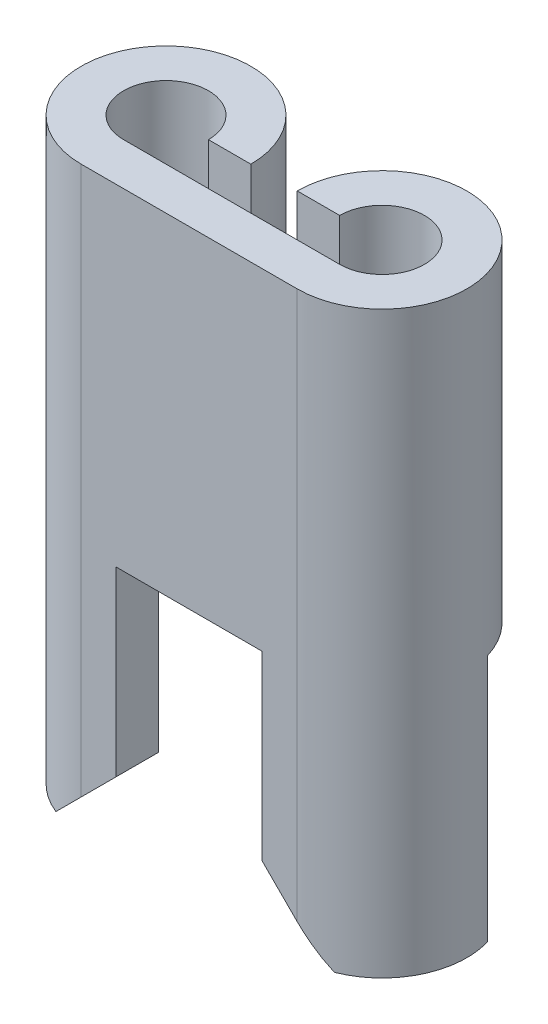
ISO-10303-21;
HEADER;
FILE_DESCRIPTION(('STEP AP214'),'2;1');
FILE_NAME('part.step','',(''),(''),'','','');
FILE_SCHEMA(('AUTOMOTIVE_DESIGN { 1 0 10303 214 1 1 1 1 }'));
ENDSEC;
DATA;
#1=APPLICATION_CONTEXT('core data for automotive mechanical design processes');
#2=APPLICATION_PROTOCOL_DEFINITION('international standard','automotive_design',2000,#1);
#3=PRODUCT_CONTEXT('',#1,'mechanical');
#4=PRODUCT('Part','Part','',(#3));
#5=PRODUCT_RELATED_PRODUCT_CATEGORY('part','',(#4));
#6=PRODUCT_DEFINITION_FORMATION('','',#4);
#7=PRODUCT_DEFINITION_CONTEXT('part definition',#1,'design');
#8=PRODUCT_DEFINITION('design','',#6,#7);
#9=PRODUCT_DEFINITION_SHAPE('','',#8);
#10=(LENGTH_UNIT() NAMED_UNIT(*) SI_UNIT(.MILLI.,.METRE.));
#11=(NAMED_UNIT(*) PLANE_ANGLE_UNIT() SI_UNIT($,.RADIAN.));
#12=(NAMED_UNIT(*) SI_UNIT($,.STERADIAN.) SOLID_ANGLE_UNIT());
#13=UNCERTAINTY_MEASURE_WITH_UNIT(LENGTH_MEASURE(1.E-05),#10,'distance_accuracy_value','');
#14=(GEOMETRIC_REPRESENTATION_CONTEXT(3) GLOBAL_UNCERTAINTY_ASSIGNED_CONTEXT((#13)) GLOBAL_UNIT_ASSIGNED_CONTEXT((#10,
#11,#12)) REPRESENTATION_CONTEXT('',''));
#15=CARTESIAN_POINT('',(0.,0.,0.));
#16=DIRECTION('',(0.,0.,1.));
#17=DIRECTION('',(1.,0.,0.));
#18=AXIS2_PLACEMENT_3D('',#15,#16,#17);
#19=CARTESIAN_POINT('',(7.3914,0.,0.));
#20=DIRECTION('',(0.,-1.,0.));
#21=DIRECTION('',(0.,0.,-1.));
#22=AXIS2_PLACEMENT_3D('',#19,#20,#21);
#23=PLANE('',#22);
#24=DIRECTION('',(1.,0.,0.));
#25=VECTOR('',#24,1.);
#26=CARTESIAN_POINT('',(2.8956,0.,-1.27));
#27=LINE('',#26,#25);
#28=CARTESIAN_POINT('',(6.4378208330104,0.,-1.27));
#29=VERTEX_POINT('',#28);
#30=CARTESIAN_POINT('',(7.32578189733086,0.,-1.27));
#31=VERTEX_POINT('',#30);
#32=EDGE_CURVE('E126',#29,#31,#27,.T.);
#33=ORIENTED_EDGE('',*,*,#32,.T.);
#34=CARTESIAN_POINT('',(5.7658,0.,-0.8128));
#35=DIRECTION('',(0.,1.,0.));
#36=DIRECTION('',(-1.,0.,0.));
#37=AXIS2_PLACEMENT_3D('',#34,#35,#36);
#38=CIRCLE('',#37,1.6256);
#39=CARTESIAN_POINT('',(6.36377916698959,0.,0.698820413942082));
#40=VERTEX_POINT('',#39);
#41=EDGE_CURVE('E192',#40,#31,#38,.T.);
#42=ORIENTED_EDGE('',*,*,#41,.F.);
#43=DIRECTION('',(0.,0.,1.));
#44=VECTOR('',#43,1.);
#45=CARTESIAN_POINT('',(6.36377916698959,0.,-0.635));
#46=LINE('',#45,#44);
#47=CARTESIAN_POINT('',(6.36377916698959,0.,-0.262286825001952));
#48=VERTEX_POINT('',#47);
#49=EDGE_CURVE('E128',#48,#40,#46,.T.);
#50=ORIENTED_EDGE('',*,*,#49,.F.);
#51=CARTESIAN_POINT('',(5.7658,0.,-0.8128));
#52=DIRECTION('',(0.,1.,0.));
#53=DIRECTION('',(-1.,0.,0.));
#54=AXIS2_PLACEMENT_3D('',#51,#52,#53);
#55=CIRCLE('',#54,0.8128);
#56=EDGE_CURVE('E20',#48,#29,#55,.T.);
#57=ORIENTED_EDGE('',*,*,#56,.T.);
#58=EDGE_LOOP('',(#33,#42,#50,#57));
#59=FACE_BOUND('',#58,.T.);
#60=ADVANCED_FACE('F17',(#59),#23,.T.);
#61=CARTESIAN_POINT('',(7.9756,4.7498,-1.27));
#62=DIRECTION('',(0.,1.,0.));
#63=DIRECTION('',(0.,0.,1.));
#64=AXIS2_PLACEMENT_3D('',#61,#62,#63);
#65=PLANE('',#64);
#66=DIRECTION('',(1.,0.,0.));
#67=VECTOR('',#66,1.);
#68=CARTESIAN_POINT('',(4.95299999999999,4.7498,-0.8128));
#69=LINE('',#68,#67);
#70=CARTESIAN_POINT('',(4.14019999999999,4.7498,-0.8128));
#71=VERTEX_POINT('',#70);
#72=CARTESIAN_POINT('',(4.953,4.7498,-0.8128));
#73=VERTEX_POINT('',#72);
#74=EDGE_CURVE('E130',#71,#73,#69,.T.);
#75=ORIENTED_EDGE('',*,*,#74,.F.);
#76=CARTESIAN_POINT('',(5.76579999999999,4.7498,-0.8128));
#77=DIRECTION('',(0.,1.,0.));
#78=DIRECTION('',(-1.,0.,0.));
#79=AXIS2_PLACEMENT_3D('',#76,#77,#78);
#80=CIRCLE('',#79,1.6256);
#81=CARTESIAN_POINT('',(7.32578189733086,4.7498,-1.27));
#82=VERTEX_POINT('',#81);
#83=EDGE_CURVE('E189',#82,#71,#80,.T.);
#84=ORIENTED_EDGE('',*,*,#83,.F.);
#85=DIRECTION('',(1.,0.,0.));
#86=VECTOR('',#85,1.);
#87=CARTESIAN_POINT('',(2.8956,4.7498,-1.27));
#88=LINE('',#87,#86);
#89=CARTESIAN_POINT('',(6.4378208330104,4.7498,-1.27));
#90=VERTEX_POINT('',#89);
#91=EDGE_CURVE('E139',#82,#90,#88,.F.);
#92=ORIENTED_EDGE('',*,*,#91,.T.);
#93=CARTESIAN_POINT('',(5.76579999999999,4.7498,-0.8128));
#94=DIRECTION('',(0.,1.,0.));
#95=DIRECTION('',(-1.,0.,0.));
#96=AXIS2_PLACEMENT_3D('',#93,#94,#95);
#97=CIRCLE('',#96,0.8128);
#98=EDGE_CURVE('E144',#90,#73,#97,.T.);
#99=ORIENTED_EDGE('',*,*,#98,.T.);
#100=EDGE_LOOP('',(#75,#84,#92,#99));
#101=FACE_BOUND('',#100,.T.);
#102=ADVANCED_FACE('F484',(#101),#65,.F.);
#103=CARTESIAN_POINT('',(4.95299999999999,0.,-0.8128));
#104=DIRECTION('',(0.,0.,1.));
#105=DIRECTION('',(1.,0.,0.));
#106=AXIS2_PLACEMENT_3D('',#103,#104,#105);
#107=PLANE('',#106);
#108=DIRECTION('',(1.,0.,0.));
#109=VECTOR('',#108,1.);
#110=CARTESIAN_POINT('',(4.95299999999999,11.0998,-0.8128));
#111=LINE('',#110,#109);
#112=CARTESIAN_POINT('',(4.95299999999999,11.0998,-0.8128));
#113=VERTEX_POINT('',#112);
#114=CARTESIAN_POINT('',(4.14019999999999,11.0998,-0.8128));
#115=VERTEX_POINT('',#114);
#116=EDGE_CURVE('E140',#113,#115,#111,.F.);
#117=ORIENTED_EDGE('',*,*,#116,.T.);
#118=DIRECTION('',(0.,1.,0.));
#119=VECTOR('',#118,1.);
#120=CARTESIAN_POINT('',(4.14019999999999,0.,-0.8128));
#121=LINE('',#120,#119);
#122=EDGE_CURVE('E152',#71,#115,#121,.T.);
#123=ORIENTED_EDGE('',*,*,#122,.F.);
#124=ORIENTED_EDGE('',*,*,#74,.T.);
#125=DIRECTION('',(0.,1.,0.));
#126=VECTOR('',#125,1.);
#127=CARTESIAN_POINT('',(4.953,0.,-0.8128));
#128=LINE('',#127,#126);
#129=EDGE_CURVE('E155',#73,#113,#128,.T.);
#130=ORIENTED_EDGE('',*,*,#129,.T.);
#131=EDGE_LOOP('',(#117,#123,#124,#130));
#132=FACE_BOUND('',#131,.T.);
#133=ADVANCED_FACE('F239',(#132),#107,.T.);
#134=CARTESIAN_POINT('',(2.8956,2.3749,-1.27));
#135=DIRECTION('',(0.,0.,1.));
#136=DIRECTION('',(1.,0.,0.));
#137=AXIS2_PLACEMENT_3D('',#134,#135,#136);
#138=PLANE('',#137);
#139=ORIENTED_EDGE('',*,*,#91,.F.);
#140=DIRECTION('',(0.,1.,0.));
#141=VECTOR('',#140,1.);
#142=CARTESIAN_POINT('',(7.32578189733086,0.,-1.27));
#143=LINE('',#142,#141);
#144=EDGE_CURVE('E137',#31,#82,#143,.T.);
#145=ORIENTED_EDGE('',*,*,#144,.F.);
#146=ORIENTED_EDGE('',*,*,#32,.F.);
#147=DIRECTION('',(0.,1.,0.));
#148=VECTOR('',#147,1.);
#149=CARTESIAN_POINT('',(6.4378208330104,0.,-1.27));
#150=LINE('',#149,#148);
#151=EDGE_CURVE('E135',#29,#90,#150,.T.);
#152=ORIENTED_EDGE('',*,*,#151,.T.);
#153=EDGE_LOOP('',(#139,#145,#146,#152));
#154=FACE_BOUND('',#153,.T.);
#155=ADVANCED_FACE('F134',(#154),#138,.F.);
#156=CARTESIAN_POINT('',(2.4384,11.0998,-0.8128));
#157=DIRECTION('',(0.,0.,1.));
#158=DIRECTION('',(1.,0.,0.));
#159=AXIS2_PLACEMENT_3D('',#156,#157,#158);
#160=PLANE('',#159);
#161=DIRECTION('',(1.,0.,0.));
#162=VECTOR('',#161,1.);
#163=CARTESIAN_POINT('',(2.4384,11.0998,-0.8128));
#164=LINE('',#163,#162);
#165=CARTESIAN_POINT('',(3.2512,11.0998,-0.8128));
#166=VERTEX_POINT('',#165);
#167=CARTESIAN_POINT('',(2.4384,11.0998,-0.8128));
#168=VERTEX_POINT('',#167);
#169=EDGE_CURVE('E207',#166,#168,#164,.F.);
#170=ORIENTED_EDGE('',*,*,#169,.T.);
#171=DIRECTION('',(0.,1.,0.));
#172=VECTOR('',#171,1.);
#173=CARTESIAN_POINT('',(2.4384,11.0998,-0.8128));
#174=LINE('',#173,#172);
#175=CARTESIAN_POINT('',(2.4384,4.7498,-0.8128));
#176=VERTEX_POINT('',#175);
#177=EDGE_CURVE('E204',#168,#176,#174,.F.);
#178=ORIENTED_EDGE('',*,*,#177,.T.);
#179=DIRECTION('',(1.,0.,0.));
#180=VECTOR('',#179,1.);
#181=CARTESIAN_POINT('',(2.4384,4.7498,-0.8128));
#182=LINE('',#181,#180);
#183=CARTESIAN_POINT('',(3.2512,4.7498,-0.8128));
#184=VERTEX_POINT('',#183);
#185=EDGE_CURVE('E200',#176,#184,#182,.T.);
#186=ORIENTED_EDGE('',*,*,#185,.T.);
#187=DIRECTION('',(0.,-1.,0.));
#188=VECTOR('',#187,1.);
#189=CARTESIAN_POINT('',(3.2512,11.0998,-0.8128));
#190=LINE('',#189,#188);
#191=EDGE_CURVE('E187',#166,#184,#190,.T.);
#192=ORIENTED_EDGE('',*,*,#191,.F.);
#193=EDGE_LOOP('',(#170,#178,#186,#192));
#194=FACE_BOUND('',#193,.T.);
#195=ADVANCED_FACE('F346',(#194),#160,.T.);
#196=CARTESIAN_POINT('',(2.29762083301041,0.,-1.27));
#197=DIRECTION('',(-1.,0.,0.));
#198=DIRECTION('',(0.,0.,1.));
#199=AXIS2_PLACEMENT_3D('',#196,#197,#198);
#200=PLANE('',#199);
#201=DIRECTION('',(0.,1.,0.));
#202=VECTOR('',#201,1.);
#203=CARTESIAN_POINT('',(2.29762083301041,5.5499,0.));
#204=LINE('',#203,#202);
#205=CARTESIAN_POINT('',(2.29762083301041,1.27,0.));
#206=VERTEX_POINT('',#205);
#207=CARTESIAN_POINT('',(2.29762083301041,4.7498,0.));
#208=VERTEX_POINT('',#207);
#209=EDGE_CURVE('E146',#206,#208,#204,.T.);
#210=ORIENTED_EDGE('',*,*,#209,.T.);
#211=DIRECTION('',(0.,0.,1.));
#212=VECTOR('',#211,1.);
#213=CARTESIAN_POINT('',(2.29762083301041,4.7498,-1.27));
#214=LINE('',#213,#212);
#215=CARTESIAN_POINT('',(2.29762083301041,4.7498,0.8128));
#216=VERTEX_POINT('',#215);
#217=EDGE_CURVE('E206',#208,#216,#214,.T.);
#218=ORIENTED_EDGE('',*,*,#217,.T.);
#219=DIRECTION('',(0.,1.,0.));
#220=VECTOR('',#219,1.);
#221=CARTESIAN_POINT('',(2.29762083301041,5.5499,0.8128));
#222=LINE('',#221,#220);
#223=CARTESIAN_POINT('',(2.29762083301041,1.27,0.8128));
#224=VERTEX_POINT('',#223);
#225=EDGE_CURVE('E278',#224,#216,#222,.T.);
#226=ORIENTED_EDGE('',*,*,#225,.F.);
#227=DIRECTION('',(0.,0.,1.));
#228=VECTOR('',#227,1.);
#229=CARTESIAN_POINT('',(2.29762083301041,1.27,-0.635));
#230=LINE('',#229,#228);
#231=EDGE_CURVE('E288',#206,#224,#230,.T.);
#232=ORIENTED_EDGE('',*,*,#231,.F.);
#233=EDGE_LOOP('',(#210,#218,#226,#232));
#234=FACE_BOUND('',#233,.T.);
#235=ADVANCED_FACE('F348',(#234),#200,.F.);
#236=CARTESIAN_POINT('',(2.29762083301041,4.7498,-1.27));
#237=DIRECTION('',(0.,1.,0.));
#238=DIRECTION('',(0.,0.,1.));
#239=AXIS2_PLACEMENT_3D('',#236,#237,#238);
#240=PLANE('',#239);
#241=DIRECTION('',(0.,0.,-1.));
#242=VECTOR('',#241,1.);
#243=CARTESIAN_POINT('',(5.09377916698959,4.7498,-1.27));
#244=LINE('',#243,#242);
#245=CARTESIAN_POINT('',(5.09377916698959,4.7498,0.));
#246=VERTEX_POINT('',#245);
#247=CARTESIAN_POINT('',(5.09377916698959,4.7498,0.8128));
#248=VERTEX_POINT('',#247);
#249=EDGE_CURVE('E213',#246,#248,#244,.F.);
#250=ORIENTED_EDGE('',*,*,#249,.T.);
#251=DIRECTION('',(1.,0.,0.));
#252=VECTOR('',#251,1.);
#253=CARTESIAN_POINT('',(3.6957,4.7498,0.8128));
#254=LINE('',#253,#252);
#255=EDGE_CURVE('E269',#216,#248,#254,.T.);
#256=ORIENTED_EDGE('',*,*,#255,.F.);
#257=ORIENTED_EDGE('',*,*,#217,.F.);
#258=DIRECTION('',(1.,0.,0.));
#259=VECTOR('',#258,1.);
#260=CARTESIAN_POINT('',(3.6957,4.7498,0.));
#261=LINE('',#260,#259);
#262=EDGE_CURVE('E150',#208,#246,#261,.T.);
#263=ORIENTED_EDGE('',*,*,#262,.T.);
#264=EDGE_LOOP('',(#250,#256,#257,#263));
#265=FACE_BOUND('',#264,.T.);
#266=ADVANCED_FACE('F355',(#265),#240,.F.);
#267=CARTESIAN_POINT('',(5.09377916698959,4.7498,-1.27));
#268=DIRECTION('',(1.,0.,0.));
#269=DIRECTION('',(0.,0.,-1.));
#270=AXIS2_PLACEMENT_3D('',#267,#268,#269);
#271=PLANE('',#270);
#272=DIRECTION('',(0.,1.,0.));
#273=VECTOR('',#272,1.);
#274=CARTESIAN_POINT('',(5.09377916698959,5.5499,0.8128));
#275=LINE('',#274,#273);
#276=CARTESIAN_POINT('',(5.09377916698959,1.27,0.8128));
#277=VERTEX_POINT('',#276);
#278=EDGE_CURVE('E259',#248,#277,#275,.F.);
#279=ORIENTED_EDGE('',*,*,#278,.F.);
#280=ORIENTED_EDGE('',*,*,#249,.F.);
#281=DIRECTION('',(0.,1.,0.));
#282=VECTOR('',#281,1.);
#283=CARTESIAN_POINT('',(5.09377916698959,5.5499,0.));
#284=LINE('',#283,#282);
#285=CARTESIAN_POINT('',(5.09377916698959,1.27,0.));
#286=VERTEX_POINT('',#285);
#287=EDGE_CURVE('E226',#246,#286,#284,.F.);
#288=ORIENTED_EDGE('',*,*,#287,.T.);
#289=DIRECTION('',(0.,0.,1.));
#290=VECTOR('',#289,1.);
#291=CARTESIAN_POINT('',(5.09377916698959,1.27,-0.635));
#292=LINE('',#291,#290);
#293=EDGE_CURVE('E196',#277,#286,#292,.F.);
#294=ORIENTED_EDGE('',*,*,#293,.F.);
#295=EDGE_LOOP('',(#279,#280,#288,#294));
#296=FACE_BOUND('',#295,.T.);
#297=ADVANCED_FACE('F387',(#296),#271,.F.);
#298=CARTESIAN_POINT('',(5.72877916698959,0.635,-0.635));
#299=DIRECTION('',(-0.707106781186548,-0.707106781186547,0.));
#300=DIRECTION('',(0.707106781186547,-0.707106781186548,0.));
#301=AXIS2_PLACEMENT_3D('',#298,#299,#300);
#302=PLANE('',#301);
#303=ORIENTED_EDGE('',*,*,#293,.T.);
#304=DIRECTION('',(0.707106781186547,-0.707106781186548,0.));
#305=VECTOR('',#304,1.);
#306=CARTESIAN_POINT('',(5.09377916698959,1.27,0.));
#307=LINE('',#306,#305);
#308=CARTESIAN_POINT('',(5.7658,0.597979166989594,0.));
#309=VERTEX_POINT('',#308);
#310=EDGE_CURVE('E223',#286,#309,#307,.T.);
#311=ORIENTED_EDGE('',*,*,#310,.T.);
#312=CARTESIAN_POINT('',(5.7658,0.597979166989595,-0.8128));
#313=DIRECTION('',(-0.707106781186548,-0.707106781186547,0.));
#314=DIRECTION('',(-0.707106781186547,0.707106781186548,0.));
#315=AXIS2_PLACEMENT_3D('',#312,#313,#314);
#316=ELLIPSE('',#315,1.14947278349685,0.8128);
#317=EDGE_CURVE('E147',#309,#48,#316,.F.);
#318=ORIENTED_EDGE('',*,*,#317,.T.);
#319=ORIENTED_EDGE('',*,*,#49,.T.);
#320=CARTESIAN_POINT('',(5.7658,0.597979166989595,-0.8128));
#321=DIRECTION('',(-0.707106781186548,-0.707106781186547,0.));
#322=DIRECTION('',(-0.707106781186547,0.707106781186548,0.));
#323=AXIS2_PLACEMENT_3D('',#320,#321,#322);
#324=ELLIPSE('',#323,2.29894556699371,1.6256);
#325=CARTESIAN_POINT('',(5.7658,0.597979166989593,0.8128));
#326=VERTEX_POINT('',#325);
#327=EDGE_CURVE('E194',#326,#40,#324,.F.);
#328=ORIENTED_EDGE('',*,*,#327,.F.);
#329=DIRECTION('',(0.707106781186547,-0.707106781186548,0.));
#330=VECTOR('',#329,1.);
#331=CARTESIAN_POINT('',(5.09377916698959,1.27,0.8128));
#332=LINE('',#331,#330);
#333=EDGE_CURVE('E256',#277,#326,#332,.T.);
#334=ORIENTED_EDGE('',*,*,#333,.F.);
#335=EDGE_LOOP('',(#303,#311,#318,#319,#328,#334));
#336=FACE_BOUND('',#335,.T.);
#337=ADVANCED_FACE('F384',(#336),#302,.T.);
#338=CARTESIAN_POINT('',(5.7658,0.,-0.8128));
#339=DIRECTION('',(0.,1.,0.));
#340=DIRECTION('',(-1.,0.,0.));
#341=AXIS2_PLACEMENT_3D('',#338,#339,#340);
#342=CYLINDRICAL_SURFACE('',#341,1.6256);
#343=ORIENTED_EDGE('',*,*,#122,.T.);
#344=CARTESIAN_POINT('',(5.76579999999999,11.0998,-0.8128));
#345=DIRECTION('',(0.,1.,0.));
#346=DIRECTION('',(-1.,0.,0.));
#347=AXIS2_PLACEMENT_3D('',#344,#345,#346);
#348=CIRCLE('',#347,1.6256);
#349=CARTESIAN_POINT('',(5.7658,11.0998,0.8128));
#350=VERTEX_POINT('',#349);
#351=EDGE_CURVE('E174',#350,#115,#348,.T.);
#352=ORIENTED_EDGE('',*,*,#351,.F.);
#353=DIRECTION('',(0.,1.,0.));
#354=VECTOR('',#353,1.);
#355=CARTESIAN_POINT('',(5.7658,5.5499,0.8128));
#356=LINE('',#355,#354);
#357=EDGE_CURVE('E254',#326,#350,#356,.T.);
#358=ORIENTED_EDGE('',*,*,#357,.F.);
#359=ORIENTED_EDGE('',*,*,#327,.T.);
#360=ORIENTED_EDGE('',*,*,#41,.T.);
#361=ORIENTED_EDGE('',*,*,#144,.T.);
#362=ORIENTED_EDGE('',*,*,#83,.T.);
#363=EDGE_LOOP('',(#343,#352,#358,#359,#360,#361,#362));
#364=FACE_BOUND('',#363,.T.);
#365=ADVANCED_FACE('F248',(#364),#342,.T.);
#366=CARTESIAN_POINT('',(5.7658,0.,-0.8128));
#367=DIRECTION('',(0.,1.,0.));
#368=DIRECTION('',(-1.,0.,0.));
#369=AXIS2_PLACEMENT_3D('',#366,#367,#368);
#370=CYLINDRICAL_SURFACE('',#369,0.8128);
#371=ORIENTED_EDGE('',*,*,#98,.F.);
#372=ORIENTED_EDGE('',*,*,#151,.F.);
#373=ORIENTED_EDGE('',*,*,#56,.F.);
#374=ORIENTED_EDGE('',*,*,#317,.F.);
#375=DIRECTION('',(0.,1.,0.));
#376=VECTOR('',#375,1.);
#377=CARTESIAN_POINT('',(5.7658,5.5499,0.));
#378=LINE('',#377,#376);
#379=CARTESIAN_POINT('',(5.7658,11.0998,0.));
#380=VERTEX_POINT('',#379);
#381=EDGE_CURVE('E225',#309,#380,#378,.T.);
#382=ORIENTED_EDGE('',*,*,#381,.T.);
#383=CARTESIAN_POINT('',(5.76579999999999,11.0998,-0.8128));
#384=DIRECTION('',(0.,1.,0.));
#385=DIRECTION('',(-1.,0.,0.));
#386=AXIS2_PLACEMENT_3D('',#383,#384,#385);
#387=CIRCLE('',#386,0.8128);
#388=EDGE_CURVE('E171',#113,#380,#387,.F.);
#389=ORIENTED_EDGE('',*,*,#388,.F.);
#390=ORIENTED_EDGE('',*,*,#129,.F.);
#391=EDGE_LOOP('',(#371,#372,#373,#374,#382,#389,#390));
#392=FACE_BOUND('',#391,.T.);
#393=ADVANCED_FACE('F142',(#392),#370,.F.);
#394=CARTESIAN_POINT('',(3.6957,5.5499,0.));
#395=DIRECTION('',(0.,0.,1.));
#396=DIRECTION('',(1.,0.,0.));
#397=AXIS2_PLACEMENT_3D('',#394,#395,#396);
#398=PLANE('',#397);
#399=DIRECTION('',(0.,-1.,0.));
#400=VECTOR('',#399,1.);
#401=CARTESIAN_POINT('',(1.6256,11.0998,0.));
#402=LINE('',#401,#400);
#403=CARTESIAN_POINT('',(1.6256,0.597979166989595,0.));
#404=VERTEX_POINT('',#403);
#405=CARTESIAN_POINT('',(1.6256,11.0998,0.));
#406=VERTEX_POINT('',#405);
#407=EDGE_CURVE('E315',#404,#406,#402,.F.);
#408=ORIENTED_EDGE('',*,*,#407,.T.);
#409=DIRECTION('',(1.,0.,0.));
#410=VECTOR('',#409,1.);
#411=CARTESIAN_POINT('',(0.,11.0998,0.));
#412=LINE('',#411,#410);
#413=EDGE_CURVE('E170',#380,#406,#412,.F.);
#414=ORIENTED_EDGE('',*,*,#413,.F.);
#415=ORIENTED_EDGE('',*,*,#381,.F.);
#416=ORIENTED_EDGE('',*,*,#310,.F.);
#417=ORIENTED_EDGE('',*,*,#287,.F.);
#418=ORIENTED_EDGE('',*,*,#262,.F.);
#419=ORIENTED_EDGE('',*,*,#209,.F.);
#420=DIRECTION('',(0.707106781186548,0.707106781186548,0.));
#421=VECTOR('',#420,1.);
#422=CARTESIAN_POINT('',(1.66262083301041,0.635,0.));
#423=LINE('',#422,#421);
#424=EDGE_CURVE('E180',#404,#206,#423,.T.);
#425=ORIENTED_EDGE('',*,*,#424,.F.);
#426=EDGE_LOOP('',(#408,#414,#415,#416,#417,#418,#419,#425));
#427=FACE_BOUND('',#426,.T.);
#428=ADVANCED_FACE('F318',(#427),#398,.F.);
#429=CARTESIAN_POINT('',(1.6256,11.0998,-0.8128));
#430=DIRECTION('',(0.,-1.,0.));
#431=DIRECTION('',(1.,0.,0.));
#432=AXIS2_PLACEMENT_3D('',#429,#430,#431);
#433=CYLINDRICAL_SURFACE('',#432,0.8128);
#434=CARTESIAN_POINT('',(1.6256,11.0998,-0.8128));
#435=DIRECTION('',(0.,-1.,0.));
#436=DIRECTION('',(1.,0.,0.));
#437=AXIS2_PLACEMENT_3D('',#434,#435,#436);
#438=CIRCLE('',#437,0.8128);
#439=EDGE_CURVE('E168',#406,#168,#438,.T.);
#440=ORIENTED_EDGE('',*,*,#439,.F.);
#441=ORIENTED_EDGE('',*,*,#407,.F.);
#442=CARTESIAN_POINT('',(1.6256,0.597979166989594,-0.8128));
#443=DIRECTION('',(0.707106781186548,-0.707106781186548,0.));
#444=DIRECTION('',(-0.707106781186548,-0.707106781186548,0.));
#445=AXIS2_PLACEMENT_3D('',#442,#443,#444);
#446=ELLIPSE('',#445,1.14947278349685,0.8128);
#447=CARTESIAN_POINT('',(1.02762083301041,0.,-0.262286825001952));
#448=VERTEX_POINT('',#447);
#449=EDGE_CURVE('E177',#448,#404,#446,.F.);
#450=ORIENTED_EDGE('',*,*,#449,.F.);
#451=CARTESIAN_POINT('',(1.6256,0.,-0.8128));
#452=DIRECTION('',(0.,-1.,0.));
#453=DIRECTION('',(1.,0.,0.));
#454=AXIS2_PLACEMENT_3D('',#451,#452,#453);
#455=CIRCLE('',#454,0.8128);
#456=CARTESIAN_POINT('',(0.953579166989594,0.,-1.27));
#457=VERTEX_POINT('',#456);
#458=EDGE_CURVE('E182',#457,#448,#455,.F.);
#459=ORIENTED_EDGE('',*,*,#458,.F.);
#460=DIRECTION('',(0.,1.,0.));
#461=VECTOR('',#460,1.);
#462=CARTESIAN_POINT('',(0.953579166989594,2.3749,-1.27));
#463=LINE('',#462,#461);
#464=CARTESIAN_POINT('',(0.953579166989593,4.7498,-1.27));
#465=VERTEX_POINT('',#464);
#466=EDGE_CURVE('E220',#457,#465,#463,.T.);
#467=ORIENTED_EDGE('',*,*,#466,.T.);
#468=CARTESIAN_POINT('',(1.6256,4.7498,-0.8128));
#469=DIRECTION('',(0.,-1.,0.));
#470=DIRECTION('',(1.,0.,0.));
#471=AXIS2_PLACEMENT_3D('',#468,#469,#470);
#472=CIRCLE('',#471,0.8128);
#473=EDGE_CURVE('E185',#465,#176,#472,.T.);
#474=ORIENTED_EDGE('',*,*,#473,.T.);
#475=ORIENTED_EDGE('',*,*,#177,.F.);
#476=EDGE_LOOP('',(#440,#441,#450,#459,#467,#474,#475));
#477=FACE_BOUND('',#476,.T.);
#478=ADVANCED_FACE('F322',(#477),#433,.F.);
#479=CARTESIAN_POINT('',(7.9756,4.7498,-1.27));
#480=DIRECTION('',(0.,1.,0.));
#481=DIRECTION('',(0.,0.,1.));
#482=AXIS2_PLACEMENT_3D('',#479,#480,#481);
#483=PLANE('',#482);
#484=DIRECTION('',(1.,0.,0.));
#485=VECTOR('',#484,1.);
#486=CARTESIAN_POINT('',(2.8956,4.7498,-1.27));
#487=LINE('',#486,#485);
#488=CARTESIAN_POINT('',(0.0656181026691354,4.7498,-1.27));
#489=VERTEX_POINT('',#488);
#490=EDGE_CURVE('E186',#465,#489,#487,.F.);
#491=ORIENTED_EDGE('',*,*,#490,.T.);
#492=CARTESIAN_POINT('',(1.6256,4.7498,-0.8128));
#493=DIRECTION('',(0.,-1.,0.));
#494=DIRECTION('',(1.,0.,0.));
#495=AXIS2_PLACEMENT_3D('',#492,#493,#494);
#496=CIRCLE('',#495,1.6256);
#497=EDGE_CURVE('E165',#184,#489,#496,.F.);
#498=ORIENTED_EDGE('',*,*,#497,.F.);
#499=ORIENTED_EDGE('',*,*,#185,.F.);
#500=ORIENTED_EDGE('',*,*,#473,.F.);
#501=EDGE_LOOP('',(#491,#498,#499,#500));
#502=FACE_BOUND('',#501,.T.);
#503=ADVANCED_FACE('F345',(#502),#483,.F.);
#504=CARTESIAN_POINT('',(2.8956,2.3749,-1.27));
#505=DIRECTION('',(0.,0.,1.));
#506=DIRECTION('',(1.,0.,0.));
#507=AXIS2_PLACEMENT_3D('',#504,#505,#506);
#508=PLANE('',#507);
#509=DIRECTION('',(1.,0.,0.));
#510=VECTOR('',#509,1.);
#511=CARTESIAN_POINT('',(7.3914,0.,-1.27));
#512=LINE('',#511,#510);
#513=CARTESIAN_POINT('',(0.0656181026691369,0.,-1.27));
#514=VERTEX_POINT('',#513);
#515=EDGE_CURVE('E184',#514,#457,#512,.T.);
#516=ORIENTED_EDGE('',*,*,#515,.F.);
#517=DIRECTION('',(0.,-1.,0.));
#518=VECTOR('',#517,1.);
#519=CARTESIAN_POINT('',(0.0656181026691335,11.0998,-1.27));
#520=LINE('',#519,#518);
#521=EDGE_CURVE('E164',#489,#514,#520,.T.);
#522=ORIENTED_EDGE('',*,*,#521,.F.);
#523=ORIENTED_EDGE('',*,*,#490,.F.);
#524=ORIENTED_EDGE('',*,*,#466,.F.);
#525=EDGE_LOOP('',(#516,#522,#523,#524));
#526=FACE_BOUND('',#525,.T.);
#527=ADVANCED_FACE('F343',(#526),#508,.F.);
#528=CARTESIAN_POINT('',(7.3914,0.,0.));
#529=DIRECTION('',(0.,-1.,0.));
#530=DIRECTION('',(0.,0.,-1.));
#531=AXIS2_PLACEMENT_3D('',#528,#529,#530);
#532=PLANE('',#531);
#533=ORIENTED_EDGE('',*,*,#515,.T.);
#534=ORIENTED_EDGE('',*,*,#458,.T.);
#535=DIRECTION('',(0.,0.,1.));
#536=VECTOR('',#535,1.);
#537=CARTESIAN_POINT('',(1.02762083301041,0.,-0.635));
#538=LINE('',#537,#536);
#539=CARTESIAN_POINT('',(1.02762083301041,0.,0.698820413942082));
#540=VERTEX_POINT('',#539);
#541=EDGE_CURVE('E181',#540,#448,#538,.F.);
#542=ORIENTED_EDGE('',*,*,#541,.F.);
#543=CARTESIAN_POINT('',(1.6256,0.,-0.8128));
#544=DIRECTION('',(0.,-1.,0.));
#545=DIRECTION('',(1.,0.,0.));
#546=AXIS2_PLACEMENT_3D('',#543,#544,#545);
#547=CIRCLE('',#546,1.6256);
#548=EDGE_CURVE('E161',#514,#540,#547,.F.);
#549=ORIENTED_EDGE('',*,*,#548,.F.);
#550=EDGE_LOOP('',(#533,#534,#542,#549));
#551=FACE_BOUND('',#550,.T.);
#552=ADVANCED_FACE('F337',(#551),#532,.T.);
#553=CARTESIAN_POINT('',(1.66262083301041,0.635,-0.635));
#554=DIRECTION('',(0.707106781186548,-0.707106781186548,0.));
#555=DIRECTION('',(0.707106781186548,0.707106781186548,0.));
#556=AXIS2_PLACEMENT_3D('',#553,#554,#555);
#557=PLANE('',#556);
#558=ORIENTED_EDGE('',*,*,#231,.T.);
#559=DIRECTION('',(0.707106781186548,0.707106781186547,0.));
#560=VECTOR('',#559,1.);
#561=CARTESIAN_POINT('',(1.6256,0.597979166989594,0.8128));
#562=LINE('',#561,#560);
#563=CARTESIAN_POINT('',(1.6256,0.597979166989594,0.8128));
#564=VERTEX_POINT('',#563);
#565=EDGE_CURVE('E285',#564,#224,#562,.T.);
#566=ORIENTED_EDGE('',*,*,#565,.F.);
#567=CARTESIAN_POINT('',(1.6256,0.597979166989594,-0.8128));
#568=DIRECTION('',(0.707106781186548,-0.707106781186548,0.));
#569=DIRECTION('',(-0.707106781186548,-0.707106781186548,0.));
#570=AXIS2_PLACEMENT_3D('',#567,#568,#569);
#571=ELLIPSE('',#570,2.2989455669937,1.6256);
#572=EDGE_CURVE('E158',#540,#564,#571,.F.);
#573=ORIENTED_EDGE('',*,*,#572,.F.);
#574=ORIENTED_EDGE('',*,*,#541,.T.);
#575=ORIENTED_EDGE('',*,*,#449,.T.);
#576=ORIENTED_EDGE('',*,*,#424,.T.);
#577=EDGE_LOOP('',(#558,#566,#573,#574,#575,#576));
#578=FACE_BOUND('',#577,.T.);
#579=ADVANCED_FACE('F333',(#578),#557,.T.);
#580=CARTESIAN_POINT('',(3.6957,5.5499,0.8128));
#581=DIRECTION('',(0.,0.,1.));
#582=DIRECTION('',(1.,0.,0.));
#583=AXIS2_PLACEMENT_3D('',#580,#581,#582);
#584=PLANE('',#583);
#585=DIRECTION('',(1.,0.,0.));
#586=VECTOR('',#585,1.);
#587=CARTESIAN_POINT('',(0.,11.0998,0.8128));
#588=LINE('',#587,#586);
#589=CARTESIAN_POINT('',(1.6256,11.0998,0.8128));
#590=VERTEX_POINT('',#589);
#591=EDGE_CURVE('E35',#590,#350,#588,.T.);
#592=ORIENTED_EDGE('',*,*,#591,.F.);
#593=DIRECTION('',(0.,-1.,0.));
#594=VECTOR('',#593,1.);
#595=CARTESIAN_POINT('',(1.6256,11.0998,0.8128));
#596=LINE('',#595,#594);
#597=EDGE_CURVE('E26',#564,#590,#596,.F.);
#598=ORIENTED_EDGE('',*,*,#597,.F.);
#599=ORIENTED_EDGE('',*,*,#565,.T.);
#600=ORIENTED_EDGE('',*,*,#225,.T.);
#601=ORIENTED_EDGE('',*,*,#255,.T.);
#602=ORIENTED_EDGE('',*,*,#278,.T.);
#603=ORIENTED_EDGE('',*,*,#333,.T.);
#604=ORIENTED_EDGE('',*,*,#357,.T.);
#605=EDGE_LOOP('',(#592,#598,#599,#600,#601,#602,#603,#604));
#606=FACE_BOUND('',#605,.T.);
#607=ADVANCED_FACE('F330',(#606),#584,.T.);
#608=CARTESIAN_POINT('',(0.,11.0998,0.));
#609=DIRECTION('',(0.,1.,0.));
#610=DIRECTION('',(0.,0.,1.));
#611=AXIS2_PLACEMENT_3D('',#608,#609,#610);
#612=PLANE('',#611);
#613=ORIENTED_EDGE('',*,*,#169,.F.);
#614=CARTESIAN_POINT('',(1.6256,11.0998,-0.8128));
#615=DIRECTION('',(0.,-1.,0.));
#616=DIRECTION('',(1.,0.,0.));
#617=AXIS2_PLACEMENT_3D('',#614,#615,#616);
#618=CIRCLE('',#617,1.6256);
#619=EDGE_CURVE('E11',#590,#166,#618,.T.);
#620=ORIENTED_EDGE('',*,*,#619,.F.);
#621=ORIENTED_EDGE('',*,*,#591,.T.);
#622=ORIENTED_EDGE('',*,*,#351,.T.);
#623=ORIENTED_EDGE('',*,*,#116,.F.);
#624=ORIENTED_EDGE('',*,*,#388,.T.);
#625=ORIENTED_EDGE('',*,*,#413,.T.);
#626=ORIENTED_EDGE('',*,*,#439,.T.);
#627=EDGE_LOOP('',(#613,#620,#621,#622,#623,#624,#625,#626));
#628=FACE_BOUND('',#627,.T.);
#629=ADVANCED_FACE('F246',(#628),#612,.T.);
#630=CARTESIAN_POINT('',(1.6256,11.0998,-0.8128));
#631=DIRECTION('',(0.,-1.,0.));
#632=DIRECTION('',(1.,0.,0.));
#633=AXIS2_PLACEMENT_3D('',#630,#631,#632);
#634=CYLINDRICAL_SURFACE('',#633,1.6256);
#635=ORIENTED_EDGE('',*,*,#597,.T.);
#636=ORIENTED_EDGE('',*,*,#619,.T.);
#637=ORIENTED_EDGE('',*,*,#191,.T.);
#638=ORIENTED_EDGE('',*,*,#497,.T.);
#639=ORIENTED_EDGE('',*,*,#521,.T.);
#640=ORIENTED_EDGE('',*,*,#548,.T.);
#641=ORIENTED_EDGE('',*,*,#572,.T.);
#642=EDGE_LOOP('',(#635,#636,#637,#638,#639,#640,#641));
#643=FACE_BOUND('',#642,.T.);
#644=ADVANCED_FACE('F328',(#643),#634,.T.);
#645=CLOSED_SHELL('',(#60,#102,#133,#155,#195,#235,#266,#297,#337,#365,#393,#428,#478,#503,#527,
#552,#579,#607,#629,#644));
#646=MANIFOLD_SOLID_BREP('B1',#645);
#647=ADVANCED_BREP_SHAPE_REPRESENTATION('',(#18,#646),#14);
#648=SHAPE_DEFINITION_REPRESENTATION(#9,#647);
ENDSEC;
END-ISO-10303-21;
